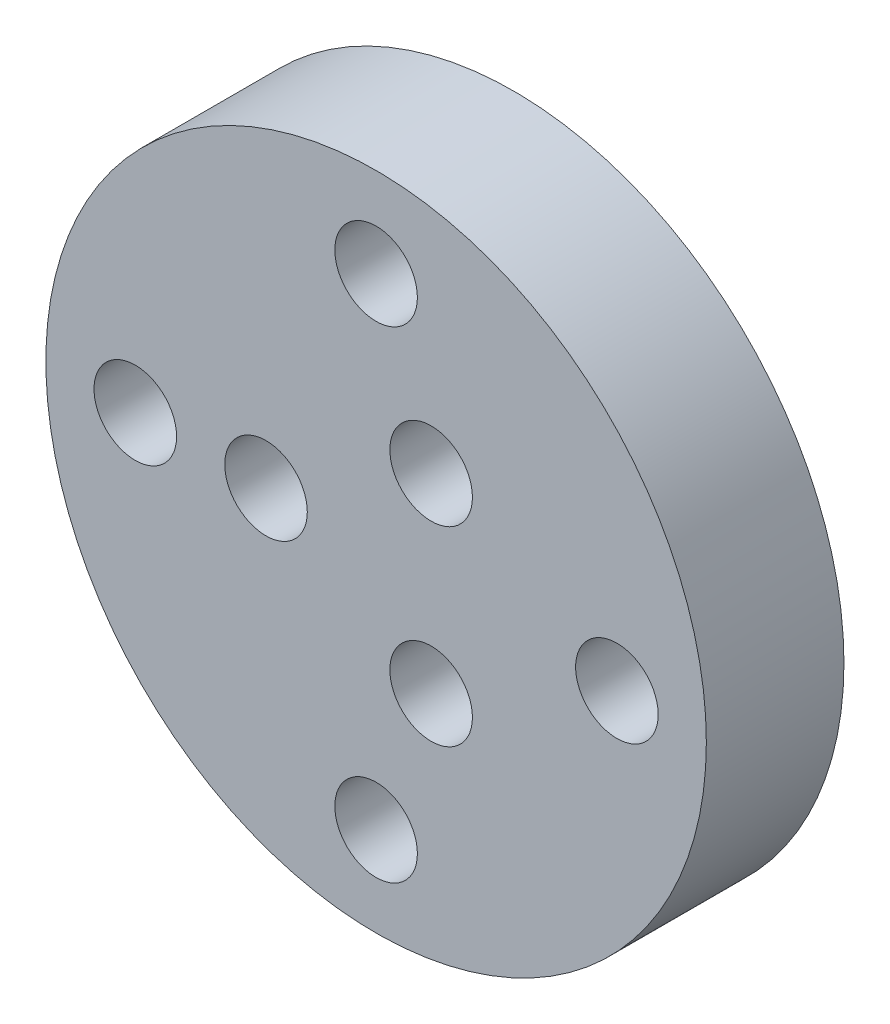
ISO-10303-21;
HEADER;
FILE_DESCRIPTION(('STEP AP214'),'2;1');
FILE_NAME('part.step','',(''),(''),'','','');
FILE_SCHEMA(('AUTOMOTIVE_DESIGN { 1 0 10303 214 1 1 1 1 }'));
ENDSEC;
DATA;
#1=APPLICATION_CONTEXT('core data for automotive mechanical design processes');
#2=APPLICATION_PROTOCOL_DEFINITION('international standard','automotive_design',2000,#1);
#3=PRODUCT_CONTEXT('',#1,'mechanical');
#4=PRODUCT('Part','Part','',(#3));
#5=PRODUCT_RELATED_PRODUCT_CATEGORY('part','',(#4));
#6=PRODUCT_DEFINITION_FORMATION('','',#4);
#7=PRODUCT_DEFINITION_CONTEXT('part definition',#1,'design');
#8=PRODUCT_DEFINITION('design','',#6,#7);
#9=PRODUCT_DEFINITION_SHAPE('','',#8);
#10=(LENGTH_UNIT() NAMED_UNIT(*) SI_UNIT(.MILLI.,.METRE.));
#11=(NAMED_UNIT(*) PLANE_ANGLE_UNIT() SI_UNIT($,.RADIAN.));
#12=(NAMED_UNIT(*) SI_UNIT($,.STERADIAN.) SOLID_ANGLE_UNIT());
#13=UNCERTAINTY_MEASURE_WITH_UNIT(LENGTH_MEASURE(1.E-05),#10,'distance_accuracy_value','');
#14=(GEOMETRIC_REPRESENTATION_CONTEXT(3) GLOBAL_UNCERTAINTY_ASSIGNED_CONTEXT((#13)) GLOBAL_UNIT_ASSIGNED_CONTEXT((#10,
#11,#12)) REPRESENTATION_CONTEXT('',''));
#15=CARTESIAN_POINT('',(0.,0.,0.));
#16=DIRECTION('',(0.,0.,1.));
#17=DIRECTION('',(1.,0.,0.));
#18=AXIS2_PLACEMENT_3D('',#15,#16,#17);
#19=CARTESIAN_POINT('',(0.,0.,10.));
#20=DIRECTION('',(0.,0.,-1.));
#21=DIRECTION('',(-1.,0.,0.));
#22=AXIS2_PLACEMENT_3D('',#19,#20,#21);
#23=CYLINDRICAL_SURFACE('',#22,24.);
#24=CARTESIAN_POINT('',(0.,0.,10.));
#25=DIRECTION('',(0.,0.,1.));
#26=DIRECTION('',(1.,0.,0.));
#27=AXIS2_PLACEMENT_3D('',#24,#25,#26);
#28=CIRCLE('',#27,24.);
#29=CARTESIAN_POINT('',(24.,0.,10.));
#30=VERTEX_POINT('',#29);
#31=EDGE_CURVE('E47',#30,#30,#28,.T.);
#32=ORIENTED_EDGE('',*,*,#31,.F.);
#33=EDGE_LOOP('',(#32));
#34=FACE_BOUND('',#33,.T.);
#35=CARTESIAN_POINT('',(0.,0.,0.));
#36=DIRECTION('',(0.,0.,1.));
#37=DIRECTION('',(1.,0.,0.));
#38=AXIS2_PLACEMENT_3D('',#35,#36,#37);
#39=CIRCLE('',#38,24.);
#40=CARTESIAN_POINT('',(24.,0.,0.));
#41=VERTEX_POINT('',#40);
#42=EDGE_CURVE('E73',#41,#41,#39,.T.);
#43=ORIENTED_EDGE('',*,*,#42,.T.);
#44=EDGE_LOOP('',(#43));
#45=FACE_BOUND('',#44,.T.);
#46=ADVANCED_FACE('F39',(#34,#45),#23,.T.);
#47=CARTESIAN_POINT('',(17.5,-1.2220184685951E-13,10.));
#48=DIRECTION('',(0.,0.,-1.));
#49=DIRECTION('',(-1.,0.,0.));
#50=AXIS2_PLACEMENT_3D('',#47,#48,#49);
#51=CYLINDRICAL_SURFACE('',#50,3.);
#52=CARTESIAN_POINT('',(17.5,-1.2220184685951E-13,10.));
#53=DIRECTION('',(0.,0.,1.));
#54=DIRECTION('',(1.,0.,0.));
#55=AXIS2_PLACEMENT_3D('',#52,#53,#54);
#56=CIRCLE('',#55,3.);
#57=CARTESIAN_POINT('',(20.5,-1.2220184685951E-13,10.));
#58=VERTEX_POINT('',#57);
#59=EDGE_CURVE('E52',#58,#58,#56,.T.);
#60=ORIENTED_EDGE('',*,*,#59,.T.);
#61=EDGE_LOOP('',(#60));
#62=FACE_BOUND('',#61,.T.);
#63=CARTESIAN_POINT('',(17.5,-1.2220184685951E-13,0.));
#64=DIRECTION('',(0.,0.,1.));
#65=DIRECTION('',(1.,0.,0.));
#66=AXIS2_PLACEMENT_3D('',#63,#64,#65);
#67=CIRCLE('',#66,3.);
#68=CARTESIAN_POINT('',(20.5,-1.2220184685951E-13,0.));
#69=VERTEX_POINT('',#68);
#70=EDGE_CURVE('E71',#69,#69,#67,.T.);
#71=ORIENTED_EDGE('',*,*,#70,.F.);
#72=EDGE_LOOP('',(#71));
#73=FACE_BOUND('',#72,.T.);
#74=ADVANCED_FACE('F100',(#62,#73),#51,.F.);
#75=CARTESIAN_POINT('',(0.,17.5,10.));
#76=DIRECTION('',(0.,0.,-1.));
#77=DIRECTION('',(-1.,0.,0.));
#78=AXIS2_PLACEMENT_3D('',#75,#76,#77);
#79=CYLINDRICAL_SURFACE('',#78,3.);
#80=CARTESIAN_POINT('',(0.,17.5,10.));
#81=DIRECTION('',(0.,0.,1.));
#82=DIRECTION('',(1.,0.,0.));
#83=AXIS2_PLACEMENT_3D('',#80,#81,#82);
#84=CIRCLE('',#83,3.);
#85=CARTESIAN_POINT('',(3.00000000000006,17.5,10.));
#86=VERTEX_POINT('',#85);
#87=EDGE_CURVE('E95',#86,#86,#84,.T.);
#88=ORIENTED_EDGE('',*,*,#87,.T.);
#89=EDGE_LOOP('',(#88));
#90=FACE_BOUND('',#89,.T.);
#91=CARTESIAN_POINT('',(0.,17.5,0.));
#92=DIRECTION('',(0.,0.,1.));
#93=DIRECTION('',(1.,0.,0.));
#94=AXIS2_PLACEMENT_3D('',#91,#92,#93);
#95=CIRCLE('',#94,3.);
#96=CARTESIAN_POINT('',(3.00000000000006,17.5,0.));
#97=VERTEX_POINT('',#96);
#98=EDGE_CURVE('E68',#97,#97,#95,.T.);
#99=ORIENTED_EDGE('',*,*,#98,.F.);
#100=EDGE_LOOP('',(#99));
#101=FACE_BOUND('',#100,.T.);
#102=ADVANCED_FACE('F118',(#90,#101),#79,.F.);
#103=CARTESIAN_POINT('',(-17.5,0.,10.));
#104=DIRECTION('',(0.,0.,-1.));
#105=DIRECTION('',(-1.,0.,0.));
#106=AXIS2_PLACEMENT_3D('',#103,#104,#105);
#107=CYLINDRICAL_SURFACE('',#106,3.);
#108=CARTESIAN_POINT('',(-17.5,0.,10.));
#109=DIRECTION('',(0.,0.,1.));
#110=DIRECTION('',(1.,0.,0.));
#111=AXIS2_PLACEMENT_3D('',#108,#109,#110);
#112=CIRCLE('',#111,3.);
#113=CARTESIAN_POINT('',(-14.5,0.,10.));
#114=VERTEX_POINT('',#113);
#115=EDGE_CURVE('E92',#114,#114,#112,.T.);
#116=ORIENTED_EDGE('',*,*,#115,.T.);
#117=EDGE_LOOP('',(#116));
#118=FACE_BOUND('',#117,.T.);
#119=CARTESIAN_POINT('',(-17.5,0.,0.));
#120=DIRECTION('',(0.,0.,1.));
#121=DIRECTION('',(1.,0.,0.));
#122=AXIS2_PLACEMENT_3D('',#119,#120,#121);
#123=CIRCLE('',#122,3.);
#124=CARTESIAN_POINT('',(-14.5,0.,0.));
#125=VERTEX_POINT('',#124);
#126=EDGE_CURVE('E65',#125,#125,#123,.T.);
#127=ORIENTED_EDGE('',*,*,#126,.F.);
#128=EDGE_LOOP('',(#127));
#129=FACE_BOUND('',#128,.T.);
#130=ADVANCED_FACE('F125',(#118,#129),#107,.F.);
#131=CARTESIAN_POINT('',(-1.83302770289265E-13,-17.5,10.));
#132=DIRECTION('',(0.,0.,-1.));
#133=DIRECTION('',(-1.,0.,0.));
#134=AXIS2_PLACEMENT_3D('',#131,#132,#133);
#135=CYLINDRICAL_SURFACE('',#134,3.);
#136=CARTESIAN_POINT('',(-1.83302770289265E-13,-17.5,10.));
#137=DIRECTION('',(0.,0.,1.));
#138=DIRECTION('',(1.,0.,0.));
#139=AXIS2_PLACEMENT_3D('',#136,#137,#138);
#140=CIRCLE('',#139,3.);
#141=CARTESIAN_POINT('',(2.99999999999982,-17.5,10.));
#142=VERTEX_POINT('',#141);
#143=EDGE_CURVE('E87',#142,#142,#140,.T.);
#144=ORIENTED_EDGE('',*,*,#143,.T.);
#145=EDGE_LOOP('',(#144));
#146=FACE_BOUND('',#145,.T.);
#147=CARTESIAN_POINT('',(-1.83302770289265E-13,-17.5,0.));
#148=DIRECTION('',(0.,0.,1.));
#149=DIRECTION('',(1.,0.,0.));
#150=AXIS2_PLACEMENT_3D('',#147,#148,#149);
#151=CIRCLE('',#150,3.);
#152=CARTESIAN_POINT('',(2.99999999999982,-17.5,0.));
#153=VERTEX_POINT('',#152);
#154=EDGE_CURVE('E62',#153,#153,#151,.T.);
#155=ORIENTED_EDGE('',*,*,#154,.F.);
#156=EDGE_LOOP('',(#155));
#157=FACE_BOUND('',#156,.T.);
#158=ADVANCED_FACE('F129',(#146,#157),#135,.F.);
#159=CARTESIAN_POINT('',(-8.,0.,10.));
#160=DIRECTION('',(0.,0.,-1.));
#161=DIRECTION('',(-1.,0.,0.));
#162=AXIS2_PLACEMENT_3D('',#159,#160,#161);
#163=CYLINDRICAL_SURFACE('',#162,3.);
#164=CARTESIAN_POINT('',(-8.,0.,10.));
#165=DIRECTION('',(0.,0.,1.));
#166=DIRECTION('',(1.,0.,0.));
#167=AXIS2_PLACEMENT_3D('',#164,#165,#166);
#168=CIRCLE('',#167,3.);
#169=CARTESIAN_POINT('',(-5.,0.,10.));
#170=VERTEX_POINT('',#169);
#171=EDGE_CURVE('E82',#170,#170,#168,.T.);
#172=ORIENTED_EDGE('',*,*,#171,.T.);
#173=EDGE_LOOP('',(#172));
#174=FACE_BOUND('',#173,.T.);
#175=CARTESIAN_POINT('',(-8.,0.,0.));
#176=DIRECTION('',(0.,0.,1.));
#177=DIRECTION('',(1.,0.,0.));
#178=AXIS2_PLACEMENT_3D('',#175,#176,#177);
#179=CIRCLE('',#178,3.);
#180=CARTESIAN_POINT('',(-5.,0.,0.));
#181=VERTEX_POINT('',#180);
#182=EDGE_CURVE('E59',#181,#181,#179,.T.);
#183=ORIENTED_EDGE('',*,*,#182,.F.);
#184=EDGE_LOOP('',(#183));
#185=FACE_BOUND('',#184,.T.);
#186=ADVANCED_FACE('F132',(#174,#185),#163,.F.);
#187=CARTESIAN_POINT('',(3.99999999999994,-6.92820323027555,10.));
#188=DIRECTION('',(0.,0.,-1.));
#189=DIRECTION('',(-1.,0.,0.));
#190=AXIS2_PLACEMENT_3D('',#187,#188,#189);
#191=CYLINDRICAL_SURFACE('',#190,3.);
#192=CARTESIAN_POINT('',(3.99999999999994,-6.92820323027555,10.));
#193=DIRECTION('',(0.,0.,1.));
#194=DIRECTION('',(1.,0.,0.));
#195=AXIS2_PLACEMENT_3D('',#192,#193,#194);
#196=CIRCLE('',#195,3.);
#197=CARTESIAN_POINT('',(6.99999999999994,-6.92820323027555,10.));
#198=VERTEX_POINT('',#197);
#199=EDGE_CURVE('E78',#198,#198,#196,.T.);
#200=ORIENTED_EDGE('',*,*,#199,.T.);
#201=EDGE_LOOP('',(#200));
#202=FACE_BOUND('',#201,.T.);
#203=CARTESIAN_POINT('',(3.99999999999994,-6.92820323027555,0.));
#204=DIRECTION('',(0.,0.,1.));
#205=DIRECTION('',(1.,0.,0.));
#206=AXIS2_PLACEMENT_3D('',#203,#204,#205);
#207=CIRCLE('',#206,3.);
#208=CARTESIAN_POINT('',(6.99999999999994,-6.92820323027555,0.));
#209=VERTEX_POINT('',#208);
#210=EDGE_CURVE('E56',#209,#209,#207,.T.);
#211=ORIENTED_EDGE('',*,*,#210,.F.);
#212=EDGE_LOOP('',(#211));
#213=FACE_BOUND('',#212,.T.);
#214=ADVANCED_FACE('F41',(#202,#213),#191,.F.);
#215=CARTESIAN_POINT('',(4.00000000000003,6.92820323027549,10.));
#216=DIRECTION('',(0.,0.,-1.));
#217=DIRECTION('',(-1.,0.,0.));
#218=AXIS2_PLACEMENT_3D('',#215,#216,#217);
#219=CYLINDRICAL_SURFACE('',#218,3.);
#220=CARTESIAN_POINT('',(4.00000000000003,6.92820323027549,10.));
#221=DIRECTION('',(0.,0.,1.));
#222=DIRECTION('',(1.,0.,0.));
#223=AXIS2_PLACEMENT_3D('',#220,#221,#222);
#224=CIRCLE('',#223,3.);
#225=CARTESIAN_POINT('',(7.00000000000003,6.92820323027549,10.));
#226=VERTEX_POINT('',#225);
#227=EDGE_CURVE('E10',#226,#226,#224,.T.);
#228=ORIENTED_EDGE('',*,*,#227,.T.);
#229=EDGE_LOOP('',(#228));
#230=FACE_BOUND('',#229,.T.);
#231=CARTESIAN_POINT('',(4.00000000000003,6.92820323027549,0.));
#232=DIRECTION('',(0.,0.,1.));
#233=DIRECTION('',(1.,0.,0.));
#234=AXIS2_PLACEMENT_3D('',#231,#232,#233);
#235=CIRCLE('',#234,3.);
#236=CARTESIAN_POINT('',(7.00000000000003,6.92820323027549,0.));
#237=VERTEX_POINT('',#236);
#238=EDGE_CURVE('E43',#237,#237,#235,.T.);
#239=ORIENTED_EDGE('',*,*,#238,.F.);
#240=EDGE_LOOP('',(#239));
#241=FACE_BOUND('',#240,.T.);
#242=ADVANCED_FACE('F107',(#230,#241),#219,.F.);
#243=CARTESIAN_POINT('',(0.,0.,10.));
#244=DIRECTION('',(0.,0.,1.));
#245=DIRECTION('',(1.,0.,0.));
#246=AXIS2_PLACEMENT_3D('',#243,#244,#245);
#247=PLANE('',#246);
#248=ORIENTED_EDGE('',*,*,#199,.F.);
#249=EDGE_LOOP('',(#248));
#250=FACE_BOUND('',#249,.T.);
#251=ORIENTED_EDGE('',*,*,#171,.F.);
#252=EDGE_LOOP('',(#251));
#253=FACE_BOUND('',#252,.T.);
#254=ORIENTED_EDGE('',*,*,#143,.F.);
#255=EDGE_LOOP('',(#254));
#256=FACE_BOUND('',#255,.T.);
#257=ORIENTED_EDGE('',*,*,#115,.F.);
#258=EDGE_LOOP('',(#257));
#259=FACE_BOUND('',#258,.T.);
#260=ORIENTED_EDGE('',*,*,#87,.F.);
#261=EDGE_LOOP('',(#260));
#262=FACE_BOUND('',#261,.T.);
#263=ORIENTED_EDGE('',*,*,#59,.F.);
#264=EDGE_LOOP('',(#263));
#265=FACE_BOUND('',#264,.T.);
#266=ORIENTED_EDGE('',*,*,#31,.T.);
#267=EDGE_LOOP('',(#266));
#268=FACE_BOUND('',#267,.T.);
#269=ORIENTED_EDGE('',*,*,#227,.F.);
#270=EDGE_LOOP('',(#269));
#271=FACE_BOUND('',#270,.T.);
#272=ADVANCED_FACE('F103',(#250,#253,#256,#259,#262,#265,#268,#271),#247,.T.);
#273=CARTESIAN_POINT('',(0.,0.,0.));
#274=DIRECTION('',(0.,0.,1.));
#275=DIRECTION('',(1.,0.,0.));
#276=AXIS2_PLACEMENT_3D('',#273,#274,#275);
#277=PLANE('',#276);
#278=ORIENTED_EDGE('',*,*,#210,.T.);
#279=EDGE_LOOP('',(#278));
#280=FACE_BOUND('',#279,.T.);
#281=ORIENTED_EDGE('',*,*,#182,.T.);
#282=EDGE_LOOP('',(#281));
#283=FACE_BOUND('',#282,.T.);
#284=ORIENTED_EDGE('',*,*,#154,.T.);
#285=EDGE_LOOP('',(#284));
#286=FACE_BOUND('',#285,.T.);
#287=ORIENTED_EDGE('',*,*,#126,.T.);
#288=EDGE_LOOP('',(#287));
#289=FACE_BOUND('',#288,.T.);
#290=ORIENTED_EDGE('',*,*,#98,.T.);
#291=EDGE_LOOP('',(#290));
#292=FACE_BOUND('',#291,.T.);
#293=ORIENTED_EDGE('',*,*,#70,.T.);
#294=EDGE_LOOP('',(#293));
#295=FACE_BOUND('',#294,.T.);
#296=ORIENTED_EDGE('',*,*,#42,.F.);
#297=EDGE_LOOP('',(#296));
#298=FACE_BOUND('',#297,.T.);
#299=ORIENTED_EDGE('',*,*,#238,.T.);
#300=EDGE_LOOP('',(#299));
#301=FACE_BOUND('',#300,.T.);
#302=ADVANCED_FACE('F106',(#280,#283,#286,#289,#292,#295,#298,#301),#277,.F.);
#303=CLOSED_SHELL('',(#46,#74,#102,#130,#158,#186,#214,#242,#272,#302));
#304=MANIFOLD_SOLID_BREP('B2',#303);
#305=ADVANCED_BREP_SHAPE_REPRESENTATION('',(#18,#304),#14);
#306=SHAPE_DEFINITION_REPRESENTATION(#9,#305);
ENDSEC;
END-ISO-10303-21;
